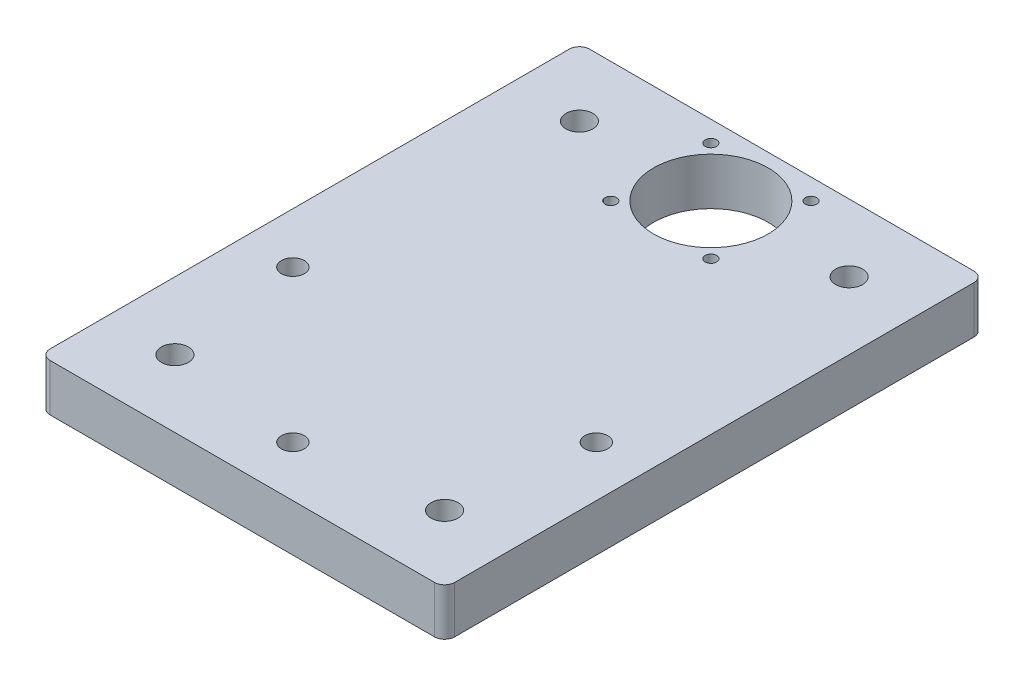
ISO-10303-21;
HEADER;
FILE_DESCRIPTION(('STEP AP214'),'2;1');
FILE_NAME('part.step','',(''),(''),'','','');
FILE_SCHEMA(('AUTOMOTIVE_DESIGN { 1 0 10303 214 1 1 1 1 }'));
ENDSEC;
DATA;
#1=APPLICATION_CONTEXT('core data for automotive mechanical design processes');
#2=APPLICATION_PROTOCOL_DEFINITION('international standard','automotive_design',2000,#1);
#3=PRODUCT_CONTEXT('',#1,'mechanical');
#4=PRODUCT('Part','Part','',(#3));
#5=PRODUCT_RELATED_PRODUCT_CATEGORY('part','',(#4));
#6=PRODUCT_DEFINITION_FORMATION('','',#4);
#7=PRODUCT_DEFINITION_CONTEXT('part definition',#1,'design');
#8=PRODUCT_DEFINITION('design','',#6,#7);
#9=PRODUCT_DEFINITION_SHAPE('','',#8);
#10=(LENGTH_UNIT() NAMED_UNIT(*) SI_UNIT(.MILLI.,.METRE.));
#11=(NAMED_UNIT(*) PLANE_ANGLE_UNIT() SI_UNIT($,.RADIAN.));
#12=(NAMED_UNIT(*) SI_UNIT($,.STERADIAN.) SOLID_ANGLE_UNIT());
#13=UNCERTAINTY_MEASURE_WITH_UNIT(LENGTH_MEASURE(1.E-05),#10,'distance_accuracy_value','');
#14=(GEOMETRIC_REPRESENTATION_CONTEXT(3) GLOBAL_UNCERTAINTY_ASSIGNED_CONTEXT((#13)) GLOBAL_UNIT_ASSIGNED_CONTEXT((#10,
#11,#12)) REPRESENTATION_CONTEXT('',''));
#15=CARTESIAN_POINT('',(0.,0.,0.));
#16=DIRECTION('',(0.,0.,1.));
#17=DIRECTION('',(1.,0.,0.));
#18=AXIS2_PLACEMENT_3D('',#15,#16,#17);
#19=CARTESIAN_POINT('',(-57.,14.,97.));
#20=DIRECTION('',(0.,-1.,0.));
#21=DIRECTION('',(0.,0.,-1.));
#22=AXIS2_PLACEMENT_3D('',#19,#20,#21);
#23=CYLINDRICAL_SURFACE('',#22,3.);
#24=CARTESIAN_POINT('',(-57.,0.,97.));
#25=DIRECTION('',(0.,1.,0.));
#26=DIRECTION('',(0.,0.,-1.));
#27=AXIS2_PLACEMENT_3D('',#24,#25,#26);
#28=CIRCLE('',#27,3.);
#29=CARTESIAN_POINT('',(-60.,0.,97.));
#30=VERTEX_POINT('',#29);
#31=CARTESIAN_POINT('',(-57.,0.,100.));
#32=VERTEX_POINT('',#31);
#33=EDGE_CURVE('E148',#30,#32,#28,.T.);
#34=ORIENTED_EDGE('',*,*,#33,.T.);
#35=DIRECTION('',(0.,-1.,0.));
#36=VECTOR('',#35,1.);
#37=CARTESIAN_POINT('',(-57.,14.,100.));
#38=LINE('',#37,#36);
#39=CARTESIAN_POINT('',(-57.,14.,100.));
#40=VERTEX_POINT('',#39);
#41=EDGE_CURVE('E11',#40,#32,#38,.T.);
#42=ORIENTED_EDGE('',*,*,#41,.F.);
#43=CARTESIAN_POINT('',(-57.,14.,97.));
#44=DIRECTION('',(0.,1.,0.));
#45=DIRECTION('',(0.,0.,-1.));
#46=AXIS2_PLACEMENT_3D('',#43,#44,#45);
#47=CIRCLE('',#46,3.);
#48=CARTESIAN_POINT('',(-60.,14.,97.));
#49=VERTEX_POINT('',#48);
#50=EDGE_CURVE('E173',#49,#40,#47,.T.);
#51=ORIENTED_EDGE('',*,*,#50,.F.);
#52=DIRECTION('',(0.,-1.,0.));
#53=VECTOR('',#52,1.);
#54=CARTESIAN_POINT('',(-60.,14.,97.));
#55=LINE('',#54,#53);
#56=EDGE_CURVE('E147',#49,#30,#55,.T.);
#57=ORIENTED_EDGE('',*,*,#56,.T.);
#58=EDGE_LOOP('',(#34,#42,#51,#57));
#59=FACE_BOUND('',#58,.T.);
#60=ADVANCED_FACE('F50',(#59),#23,.T.);
#61=CARTESIAN_POINT('',(-57.,14.,100.));
#62=DIRECTION('',(0.,0.,-1.));
#63=DIRECTION('',(-1.,0.,0.));
#64=AXIS2_PLACEMENT_3D('',#61,#62,#63);
#65=PLANE('',#64);
#66=DIRECTION('',(1.,0.,0.));
#67=VECTOR('',#66,1.);
#68=CARTESIAN_POINT('',(-57.,0.,100.));
#69=LINE('',#68,#67);
#70=CARTESIAN_POINT('',(57.,0.,100.));
#71=VERTEX_POINT('',#70);
#72=EDGE_CURVE('E155',#32,#71,#69,.T.);
#73=ORIENTED_EDGE('',*,*,#72,.T.);
#74=DIRECTION('',(0.,-1.,0.));
#75=VECTOR('',#74,1.);
#76=CARTESIAN_POINT('',(57.,14.,100.));
#77=LINE('',#76,#75);
#78=CARTESIAN_POINT('',(57.,14.,100.));
#79=VERTEX_POINT('',#78);
#80=EDGE_CURVE('E57',#79,#71,#77,.T.);
#81=ORIENTED_EDGE('',*,*,#80,.F.);
#82=DIRECTION('',(1.,0.,0.));
#83=VECTOR('',#82,1.);
#84=CARTESIAN_POINT('',(-57.,14.,100.));
#85=LINE('',#84,#83);
#86=EDGE_CURVE('E110',#40,#79,#85,.T.);
#87=ORIENTED_EDGE('',*,*,#86,.F.);
#88=ORIENTED_EDGE('',*,*,#41,.T.);
#89=EDGE_LOOP('',(#73,#81,#87,#88));
#90=FACE_BOUND('',#89,.T.);
#91=ADVANCED_FACE('F350',(#90),#65,.F.);
#92=CARTESIAN_POINT('',(57.,14.,97.));
#93=DIRECTION('',(0.,-1.,0.));
#94=DIRECTION('',(0.,0.,-1.));
#95=AXIS2_PLACEMENT_3D('',#92,#93,#94);
#96=CYLINDRICAL_SURFACE('',#95,3.);
#97=CARTESIAN_POINT('',(57.,0.,97.));
#98=DIRECTION('',(0.,1.,0.));
#99=DIRECTION('',(0.,0.,1.));
#100=AXIS2_PLACEMENT_3D('',#97,#98,#99);
#101=CIRCLE('',#100,3.);
#102=CARTESIAN_POINT('',(60.,0.,97.));
#103=VERTEX_POINT('',#102);
#104=EDGE_CURVE('E158',#71,#103,#101,.T.);
#105=ORIENTED_EDGE('',*,*,#104,.T.);
#106=DIRECTION('',(0.,-1.,0.));
#107=VECTOR('',#106,1.);
#108=CARTESIAN_POINT('',(60.,14.,97.));
#109=LINE('',#108,#107);
#110=CARTESIAN_POINT('',(60.,14.,97.));
#111=VERTEX_POINT('',#110);
#112=EDGE_CURVE('E183',#111,#103,#109,.T.);
#113=ORIENTED_EDGE('',*,*,#112,.F.);
#114=CARTESIAN_POINT('',(57.,14.,97.));
#115=DIRECTION('',(0.,1.,0.));
#116=DIRECTION('',(0.,0.,1.));
#117=AXIS2_PLACEMENT_3D('',#114,#115,#116);
#118=CIRCLE('',#117,3.);
#119=EDGE_CURVE('E193',#79,#111,#118,.T.);
#120=ORIENTED_EDGE('',*,*,#119,.F.);
#121=ORIENTED_EDGE('',*,*,#80,.T.);
#122=EDGE_LOOP('',(#105,#113,#120,#121));
#123=FACE_BOUND('',#122,.T.);
#124=ADVANCED_FACE('F194',(#123),#96,.T.);
#125=CARTESIAN_POINT('',(60.,14.,97.));
#126=DIRECTION('',(-1.,0.,0.));
#127=DIRECTION('',(0.,0.,1.));
#128=AXIS2_PLACEMENT_3D('',#125,#126,#127);
#129=PLANE('',#128);
#130=DIRECTION('',(0.,0.,-1.));
#131=VECTOR('',#130,1.);
#132=CARTESIAN_POINT('',(60.,0.,97.));
#133=LINE('',#132,#131);
#134=CARTESIAN_POINT('',(60.,0.,-57.));
#135=VERTEX_POINT('',#134);
#136=EDGE_CURVE('E163',#103,#135,#133,.T.);
#137=ORIENTED_EDGE('',*,*,#136,.T.);
#138=DIRECTION('',(0.,-1.,0.));
#139=VECTOR('',#138,1.);
#140=CARTESIAN_POINT('',(60.,14.,-57.));
#141=LINE('',#140,#139);
#142=CARTESIAN_POINT('',(60.,14.,-57.));
#143=VERTEX_POINT('',#142);
#144=EDGE_CURVE('E179',#143,#135,#141,.T.);
#145=ORIENTED_EDGE('',*,*,#144,.F.);
#146=DIRECTION('',(0.,0.,-1.));
#147=VECTOR('',#146,1.);
#148=CARTESIAN_POINT('',(60.,14.,97.));
#149=LINE('',#148,#147);
#150=EDGE_CURVE('E206',#111,#143,#149,.T.);
#151=ORIENTED_EDGE('',*,*,#150,.F.);
#152=ORIENTED_EDGE('',*,*,#112,.T.);
#153=EDGE_LOOP('',(#137,#145,#151,#152));
#154=FACE_BOUND('',#153,.T.);
#155=ADVANCED_FACE('F203',(#154),#129,.F.);
#156=CARTESIAN_POINT('',(57.,14.,-57.));
#157=DIRECTION('',(0.,-1.,0.));
#158=DIRECTION('',(0.,0.,-1.));
#159=AXIS2_PLACEMENT_3D('',#156,#157,#158);
#160=CYLINDRICAL_SURFACE('',#159,3.);
#161=CARTESIAN_POINT('',(57.,0.,-57.));
#162=DIRECTION('',(0.,1.,0.));
#163=DIRECTION('',(0.,0.,-1.));
#164=AXIS2_PLACEMENT_3D('',#161,#162,#163);
#165=CIRCLE('',#164,3.);
#166=CARTESIAN_POINT('',(57.,0.,-60.));
#167=VERTEX_POINT('',#166);
#168=EDGE_CURVE('E165',#135,#167,#165,.T.);
#169=ORIENTED_EDGE('',*,*,#168,.T.);
#170=DIRECTION('',(0.,-1.,0.));
#171=VECTOR('',#170,1.);
#172=CARTESIAN_POINT('',(57.,14.,-60.));
#173=LINE('',#172,#171);
#174=CARTESIAN_POINT('',(57.,14.,-60.));
#175=VERTEX_POINT('',#174);
#176=EDGE_CURVE('E140',#175,#167,#173,.T.);
#177=ORIENTED_EDGE('',*,*,#176,.F.);
#178=CARTESIAN_POINT('',(57.,14.,-57.));
#179=DIRECTION('',(0.,1.,0.));
#180=DIRECTION('',(0.,0.,-1.));
#181=AXIS2_PLACEMENT_3D('',#178,#179,#180);
#182=CIRCLE('',#181,3.);
#183=EDGE_CURVE('E127',#143,#175,#182,.T.);
#184=ORIENTED_EDGE('',*,*,#183,.F.);
#185=ORIENTED_EDGE('',*,*,#144,.T.);
#186=EDGE_LOOP('',(#169,#177,#184,#185));
#187=FACE_BOUND('',#186,.T.);
#188=ADVANCED_FACE('F207',(#187),#160,.T.);
#189=CARTESIAN_POINT('',(-57.,14.,-60.));
#190=DIRECTION('',(0.,0.,1.));
#191=DIRECTION('',(1.,0.,0.));
#192=AXIS2_PLACEMENT_3D('',#189,#190,#191);
#193=PLANE('',#192);
#194=DIRECTION('',(-1.,0.,0.));
#195=VECTOR('',#194,1.);
#196=CARTESIAN_POINT('',(-57.,0.,-60.));
#197=LINE('',#196,#195);
#198=CARTESIAN_POINT('',(-57.,0.,-60.));
#199=VERTEX_POINT('',#198);
#200=EDGE_CURVE('E131',#167,#199,#197,.T.);
#201=ORIENTED_EDGE('',*,*,#200,.T.);
#202=DIRECTION('',(0.,-1.,0.));
#203=VECTOR('',#202,1.);
#204=CARTESIAN_POINT('',(-57.,14.,-60.));
#205=LINE('',#204,#203);
#206=CARTESIAN_POINT('',(-57.,14.,-60.));
#207=VERTEX_POINT('',#206);
#208=EDGE_CURVE('E134',#207,#199,#205,.T.);
#209=ORIENTED_EDGE('',*,*,#208,.F.);
#210=DIRECTION('',(-1.,0.,0.));
#211=VECTOR('',#210,1.);
#212=CARTESIAN_POINT('',(-57.,14.,-60.));
#213=LINE('',#212,#211);
#214=EDGE_CURVE('E119',#175,#207,#213,.T.);
#215=ORIENTED_EDGE('',*,*,#214,.F.);
#216=ORIENTED_EDGE('',*,*,#176,.T.);
#217=EDGE_LOOP('',(#201,#209,#215,#216));
#218=FACE_BOUND('',#217,.T.);
#219=ADVANCED_FACE('F132',(#218),#193,.F.);
#220=CARTESIAN_POINT('',(-57.,14.,-57.));
#221=DIRECTION('',(0.,-1.,0.));
#222=DIRECTION('',(0.,0.,-1.));
#223=AXIS2_PLACEMENT_3D('',#220,#221,#222);
#224=CYLINDRICAL_SURFACE('',#223,3.);
#225=CARTESIAN_POINT('',(-57.,0.,-57.));
#226=DIRECTION('',(0.,1.,0.));
#227=DIRECTION('',(0.,0.,-1.));
#228=AXIS2_PLACEMENT_3D('',#225,#226,#227);
#229=CIRCLE('',#228,3.);
#230=CARTESIAN_POINT('',(-60.,0.,-57.));
#231=VERTEX_POINT('',#230);
#232=EDGE_CURVE('E93',#199,#231,#229,.T.);
#233=ORIENTED_EDGE('',*,*,#232,.T.);
#234=DIRECTION('',(0.,-1.,0.));
#235=VECTOR('',#234,1.);
#236=CARTESIAN_POINT('',(-60.,14.,-57.));
#237=LINE('',#236,#235);
#238=CARTESIAN_POINT('',(-60.,14.,-57.));
#239=VERTEX_POINT('',#238);
#240=EDGE_CURVE('E138',#239,#231,#237,.T.);
#241=ORIENTED_EDGE('',*,*,#240,.F.);
#242=CARTESIAN_POINT('',(-57.,14.,-57.));
#243=DIRECTION('',(0.,1.,0.));
#244=DIRECTION('',(0.,0.,-1.));
#245=AXIS2_PLACEMENT_3D('',#242,#243,#244);
#246=CIRCLE('',#245,3.);
#247=EDGE_CURVE('E121',#207,#239,#246,.T.);
#248=ORIENTED_EDGE('',*,*,#247,.F.);
#249=ORIENTED_EDGE('',*,*,#208,.T.);
#250=EDGE_LOOP('',(#233,#241,#248,#249));
#251=FACE_BOUND('',#250,.T.);
#252=ADVANCED_FACE('F136',(#251),#224,.T.);
#253=CARTESIAN_POINT('',(-60.,14.,97.));
#254=DIRECTION('',(1.,0.,0.));
#255=DIRECTION('',(0.,0.,-1.));
#256=AXIS2_PLACEMENT_3D('',#253,#254,#255);
#257=PLANE('',#256);
#258=DIRECTION('',(0.,0.,1.));
#259=VECTOR('',#258,1.);
#260=CARTESIAN_POINT('',(-60.,0.,97.));
#261=LINE('',#260,#259);
#262=EDGE_CURVE('E100',#231,#30,#261,.T.);
#263=ORIENTED_EDGE('',*,*,#262,.T.);
#264=ORIENTED_EDGE('',*,*,#56,.F.);
#265=DIRECTION('',(0.,0.,1.));
#266=VECTOR('',#265,1.);
#267=CARTESIAN_POINT('',(-60.,14.,97.));
#268=LINE('',#267,#266);
#269=EDGE_CURVE('E61',#239,#49,#268,.T.);
#270=ORIENTED_EDGE('',*,*,#269,.F.);
#271=ORIENTED_EDGE('',*,*,#240,.T.);
#272=EDGE_LOOP('',(#263,#264,#270,#271));
#273=FACE_BOUND('',#272,.T.);
#274=ADVANCED_FACE('F351',(#273),#257,.F.);
#275=CARTESIAN_POINT('',(-57.,14.,97.));
#276=DIRECTION('',(0.,-1.,0.));
#277=DIRECTION('',(0.,0.,-1.));
#278=AXIS2_PLACEMENT_3D('',#275,#276,#277);
#279=PLANE('',#278);
#280=CARTESIAN_POINT('',(-40.,14.,80.));
#281=DIRECTION('',(0.,-1.,0.));
#282=DIRECTION('',(0.,0.,1.));
#283=AXIS2_PLACEMENT_3D('',#280,#281,#282);
#284=CIRCLE('',#283,4.00000000000001);
#285=CARTESIAN_POINT('',(-40.,14.,84.));
#286=VERTEX_POINT('',#285);
#287=EDGE_CURVE('E298',#286,#286,#284,.T.);
#288=ORIENTED_EDGE('',*,*,#287,.T.);
#289=EDGE_LOOP('',(#288));
#290=FACE_BOUND('',#289,.T.);
#291=CARTESIAN_POINT('',(40.,14.,-39.9999999999999));
#292=DIRECTION('',(0.,-1.,0.));
#293=DIRECTION('',(0.,0.,1.));
#294=AXIS2_PLACEMENT_3D('',#291,#292,#293);
#295=CIRCLE('',#294,4.00000000000001);
#296=CARTESIAN_POINT('',(40.,14.,-35.9999999999999));
#297=VERTEX_POINT('',#296);
#298=EDGE_CURVE('E290',#297,#297,#295,.T.);
#299=ORIENTED_EDGE('',*,*,#298,.T.);
#300=EDGE_LOOP('',(#299));
#301=FACE_BOUND('',#300,.T.);
#302=CARTESIAN_POINT('',(-39.9999999999999,14.,-40.));
#303=DIRECTION('',(0.,-1.,0.));
#304=DIRECTION('',(0.,0.,-1.));
#305=AXIS2_PLACEMENT_3D('',#302,#303,#304);
#306=CIRCLE('',#305,4.00000000000001);
#307=CARTESIAN_POINT('',(-39.9999999999999,14.,-44.));
#308=VERTEX_POINT('',#307);
#309=EDGE_CURVE('E303',#308,#308,#306,.T.);
#310=ORIENTED_EDGE('',*,*,#309,.T.);
#311=EDGE_LOOP('',(#310));
#312=FACE_BOUND('',#311,.T.);
#313=CARTESIAN_POINT('',(40.,14.,80.));
#314=DIRECTION('',(0.,-1.,0.));
#315=DIRECTION('',(0.,0.,-1.));
#316=AXIS2_PLACEMENT_3D('',#313,#314,#315);
#317=CIRCLE('',#316,4.00000000000001);
#318=CARTESIAN_POINT('',(40.,14.,76.));
#319=VERTEX_POINT('',#318);
#320=EDGE_CURVE('E277',#319,#319,#317,.T.);
#321=ORIENTED_EDGE('',*,*,#320,.T.);
#322=EDGE_LOOP('',(#321));
#323=FACE_BOUND('',#322,.T.);
#324=CARTESIAN_POINT('',(4.0628570386475E-09,14.,-38.9999999963511));
#325=DIRECTION('',(0.,1.,0.));
#326=DIRECTION('',(0.,0.,1.));
#327=AXIS2_PLACEMENT_3D('',#324,#325,#326);
#328=CIRCLE('',#327,16.999999997182);
#329=CARTESIAN_POINT('',(4.0628570386475E-09,14.,-21.9999999991691));
#330=VERTEX_POINT('',#329);
#331=EDGE_CURVE('E275',#330,#330,#328,.T.);
#332=ORIENTED_EDGE('',*,*,#331,.F.);
#333=EDGE_LOOP('',(#332));
#334=FACE_BOUND('',#333,.T.);
#335=CARTESIAN_POINT('',(2.35055030994857E-13,14.,85.));
#336=DIRECTION('',(0.,-1.,0.));
#337=DIRECTION('',(0.,0.,-1.));
#338=AXIS2_PLACEMENT_3D('',#335,#336,#337);
#339=CIRCLE('',#338,3.4);
#340=CARTESIAN_POINT('',(2.35055030994857E-13,14.,81.6));
#341=VERTEX_POINT('',#340);
#342=EDGE_CURVE('E229',#341,#341,#339,.T.);
#343=ORIENTED_EDGE('',*,*,#342,.T.);
#344=EDGE_LOOP('',(#343));
#345=FACE_BOUND('',#344,.T.);
#346=CARTESIAN_POINT('',(45.,14.,40.));
#347=DIRECTION('',(0.,-1.,0.));
#348=DIRECTION('',(0.,0.,-1.));
#349=AXIS2_PLACEMENT_3D('',#346,#347,#348);
#350=CIRCLE('',#349,3.4);
#351=CARTESIAN_POINT('',(45.,14.,36.6));
#352=VERTEX_POINT('',#351);
#353=EDGE_CURVE('E260',#352,#352,#350,.T.);
#354=ORIENTED_EDGE('',*,*,#353,.T.);
#355=EDGE_LOOP('',(#354));
#356=FACE_BOUND('',#355,.T.);
#357=CARTESIAN_POINT('',(-45.,14.,40.));
#358=DIRECTION('',(0.,-1.,0.));
#359=DIRECTION('',(0.,0.,-1.));
#360=AXIS2_PLACEMENT_3D('',#357,#358,#359);
#361=CIRCLE('',#360,3.4);
#362=CARTESIAN_POINT('',(-45.,14.,36.6));
#363=VERTEX_POINT('',#362);
#364=EDGE_CURVE('E247',#363,#363,#361,.T.);
#365=ORIENTED_EDGE('',*,*,#364,.T.);
#366=EDGE_LOOP('',(#365));
#367=FACE_BOUND('',#366,.T.);
#368=CARTESIAN_POINT('',(-14.8492424049172,14.,-24.1507575950818));
#369=DIRECTION('',(0.,-1.,0.));
#370=DIRECTION('',(0.,0.,-1.));
#371=AXIS2_PLACEMENT_3D('',#368,#369,#370);
#372=CIRCLE('',#371,1.7);
#373=CARTESIAN_POINT('',(-14.8492424049172,14.,-25.8507575950818));
#374=VERTEX_POINT('',#373);
#375=EDGE_CURVE('E228',#374,#374,#372,.T.);
#376=ORIENTED_EDGE('',*,*,#375,.T.);
#377=EDGE_LOOP('',(#376));
#378=FACE_BOUND('',#377,.T.);
#379=CARTESIAN_POINT('',(-14.8492424049171,14.,-53.8492424049168));
#380=DIRECTION('',(0.,-1.,0.));
#381=DIRECTION('',(0.,0.,-1.));
#382=AXIS2_PLACEMENT_3D('',#379,#380,#381);
#383=CIRCLE('',#382,1.7);
#384=CARTESIAN_POINT('',(-14.8492424049171,14.,-55.5492424049168));
#385=VERTEX_POINT('',#384);
#386=EDGE_CURVE('E234',#385,#385,#383,.T.);
#387=ORIENTED_EDGE('',*,*,#386,.T.);
#388=EDGE_LOOP('',(#387));
#389=FACE_BOUND('',#388,.T.);
#390=CARTESIAN_POINT('',(14.849242404918,14.,-53.8492424049166));
#391=DIRECTION('',(0.,-1.,0.));
#392=DIRECTION('',(0.,0.,-1.));
#393=AXIS2_PLACEMENT_3D('',#390,#391,#392);
#394=CIRCLE('',#393,1.7);
#395=CARTESIAN_POINT('',(14.849242404918,14.,-55.5492424049166));
#396=VERTEX_POINT('',#395);
#397=EDGE_CURVE('E241',#396,#396,#394,.T.);
#398=ORIENTED_EDGE('',*,*,#397,.T.);
#399=EDGE_LOOP('',(#398));
#400=FACE_BOUND('',#399,.T.);
#401=CARTESIAN_POINT('',(14.8492424049178,14.,-24.1507575950817));
#402=DIRECTION('',(0.,-1.,0.));
#403=DIRECTION('',(0.,0.,-1.));
#404=AXIS2_PLACEMENT_3D('',#401,#402,#403);
#405=CIRCLE('',#404,1.7);
#406=CARTESIAN_POINT('',(14.8492424049178,14.,-25.8507575950817));
#407=VERTEX_POINT('',#406);
#408=EDGE_CURVE('E151',#407,#407,#405,.T.);
#409=ORIENTED_EDGE('',*,*,#408,.T.);
#410=EDGE_LOOP('',(#409));
#411=FACE_BOUND('',#410,.T.);
#412=ORIENTED_EDGE('',*,*,#50,.T.);
#413=ORIENTED_EDGE('',*,*,#86,.T.);
#414=ORIENTED_EDGE('',*,*,#119,.T.);
#415=ORIENTED_EDGE('',*,*,#150,.T.);
#416=ORIENTED_EDGE('',*,*,#183,.T.);
#417=ORIENTED_EDGE('',*,*,#214,.T.);
#418=ORIENTED_EDGE('',*,*,#247,.T.);
#419=ORIENTED_EDGE('',*,*,#269,.T.);
#420=EDGE_LOOP('',(#412,#413,#414,#415,#416,#417,#418,#419));
#421=FACE_BOUND('',#420,.T.);
#422=ADVANCED_FACE('F125',(#290,#301,#312,#323,#334,#345,#356,#367,#378,#389,#400,#411,#421),
#279,.F.);
#423=CARTESIAN_POINT('',(-57.,0.,97.));
#424=DIRECTION('',(0.,-1.,0.));
#425=DIRECTION('',(0.,0.,-1.));
#426=AXIS2_PLACEMENT_3D('',#423,#424,#425);
#427=PLANE('',#426);
#428=CARTESIAN_POINT('',(-40.,0.,80.));
#429=DIRECTION('',(0.,-1.,0.));
#430=DIRECTION('',(0.,0.,1.));
#431=AXIS2_PLACEMENT_3D('',#428,#429,#430);
#432=CIRCLE('',#431,4.00000000000001);
#433=CARTESIAN_POINT('',(-40.,0.,84.));
#434=VERTEX_POINT('',#433);
#435=EDGE_CURVE('E285',#434,#434,#432,.T.);
#436=ORIENTED_EDGE('',*,*,#435,.F.);
#437=EDGE_LOOP('',(#436));
#438=FACE_BOUND('',#437,.T.);
#439=CARTESIAN_POINT('',(40.,0.,-39.9999999999999));
#440=DIRECTION('',(0.,-1.,0.));
#441=DIRECTION('',(0.,0.,1.));
#442=AXIS2_PLACEMENT_3D('',#439,#440,#441);
#443=CIRCLE('',#442,4.00000000000001);
#444=CARTESIAN_POINT('',(40.,0.,-35.9999999999999));
#445=VERTEX_POINT('',#444);
#446=EDGE_CURVE('E293',#445,#445,#443,.T.);
#447=ORIENTED_EDGE('',*,*,#446,.F.);
#448=EDGE_LOOP('',(#447));
#449=FACE_BOUND('',#448,.T.);
#450=CARTESIAN_POINT('',(-39.9999999999999,0.,-40.));
#451=DIRECTION('',(0.,-1.,0.));
#452=DIRECTION('',(0.,0.,-1.));
#453=AXIS2_PLACEMENT_3D('',#450,#451,#452);
#454=CIRCLE('',#453,4.00000000000001);
#455=CARTESIAN_POINT('',(-39.9999999999999,0.,-44.));
#456=VERTEX_POINT('',#455);
#457=EDGE_CURVE('E292',#456,#456,#454,.T.);
#458=ORIENTED_EDGE('',*,*,#457,.F.);
#459=EDGE_LOOP('',(#458));
#460=FACE_BOUND('',#459,.T.);
#461=CARTESIAN_POINT('',(40.,0.,80.));
#462=DIRECTION('',(0.,-1.,0.));
#463=DIRECTION('',(0.,0.,-1.));
#464=AXIS2_PLACEMENT_3D('',#461,#462,#463);
#465=CIRCLE('',#464,4.00000000000001);
#466=CARTESIAN_POINT('',(40.,0.,76.));
#467=VERTEX_POINT('',#466);
#468=EDGE_CURVE('E278',#467,#467,#465,.T.);
#469=ORIENTED_EDGE('',*,*,#468,.F.);
#470=EDGE_LOOP('',(#469));
#471=FACE_BOUND('',#470,.T.);
#472=CARTESIAN_POINT('',(4.0628570386475E-09,0.,-38.9999999963511));
#473=DIRECTION('',(0.,1.,0.));
#474=DIRECTION('',(0.,0.,1.));
#475=AXIS2_PLACEMENT_3D('',#472,#473,#474);
#476=CIRCLE('',#475,16.999999997182);
#477=CARTESIAN_POINT('',(4.0628570386475E-09,0.,-21.9999999991691));
#478=VERTEX_POINT('',#477);
#479=EDGE_CURVE('E254',#478,#478,#476,.T.);
#480=ORIENTED_EDGE('',*,*,#479,.T.);
#481=EDGE_LOOP('',(#480));
#482=FACE_BOUND('',#481,.T.);
#483=CARTESIAN_POINT('',(2.35055030994857E-13,0.,85.));
#484=DIRECTION('',(0.,-1.,0.));
#485=DIRECTION('',(0.,0.,-1.));
#486=AXIS2_PLACEMENT_3D('',#483,#484,#485);
#487=CIRCLE('',#486,3.4);
#488=CARTESIAN_POINT('',(2.35055030994857E-13,0.,81.6));
#489=VERTEX_POINT('',#488);
#490=EDGE_CURVE('E261',#489,#489,#487,.T.);
#491=ORIENTED_EDGE('',*,*,#490,.F.);
#492=EDGE_LOOP('',(#491));
#493=FACE_BOUND('',#492,.T.);
#494=CARTESIAN_POINT('',(45.,0.,40.));
#495=DIRECTION('',(0.,-1.,0.));
#496=DIRECTION('',(0.,0.,-1.));
#497=AXIS2_PLACEMENT_3D('',#494,#495,#496);
#498=CIRCLE('',#497,3.4);
#499=CARTESIAN_POINT('',(45.,0.,36.6));
#500=VERTEX_POINT('',#499);
#501=EDGE_CURVE('E263',#500,#500,#498,.T.);
#502=ORIENTED_EDGE('',*,*,#501,.F.);
#503=EDGE_LOOP('',(#502));
#504=FACE_BOUND('',#503,.T.);
#505=CARTESIAN_POINT('',(-45.,0.,40.));
#506=DIRECTION('',(0.,-1.,0.));
#507=DIRECTION('',(0.,0.,-1.));
#508=AXIS2_PLACEMENT_3D('',#505,#506,#507);
#509=CIRCLE('',#508,3.4);
#510=CARTESIAN_POINT('',(-45.,0.,36.6));
#511=VERTEX_POINT('',#510);
#512=EDGE_CURVE('E255',#511,#511,#509,.T.);
#513=ORIENTED_EDGE('',*,*,#512,.F.);
#514=EDGE_LOOP('',(#513));
#515=FACE_BOUND('',#514,.T.);
#516=CARTESIAN_POINT('',(-14.8492424049172,0.,-24.1507575950818));
#517=DIRECTION('',(0.,-1.,0.));
#518=DIRECTION('',(0.,0.,-1.));
#519=AXIS2_PLACEMENT_3D('',#516,#517,#518);
#520=CIRCLE('',#519,1.7);
#521=CARTESIAN_POINT('',(-14.8492424049172,0.,-25.8507575950818));
#522=VERTEX_POINT('',#521);
#523=EDGE_CURVE('E230',#522,#522,#520,.T.);
#524=ORIENTED_EDGE('',*,*,#523,.F.);
#525=EDGE_LOOP('',(#524));
#526=FACE_BOUND('',#525,.T.);
#527=CARTESIAN_POINT('',(-14.8492424049171,0.,-53.8492424049168));
#528=DIRECTION('',(0.,-1.,0.));
#529=DIRECTION('',(0.,0.,-1.));
#530=AXIS2_PLACEMENT_3D('',#527,#528,#529);
#531=CIRCLE('',#530,1.7);
#532=CARTESIAN_POINT('',(-14.8492424049171,0.,-55.5492424049168));
#533=VERTEX_POINT('',#532);
#534=EDGE_CURVE('E238',#533,#533,#531,.T.);
#535=ORIENTED_EDGE('',*,*,#534,.F.);
#536=EDGE_LOOP('',(#535));
#537=FACE_BOUND('',#536,.T.);
#538=CARTESIAN_POINT('',(14.849242404918,0.,-53.8492424049166));
#539=DIRECTION('',(0.,-1.,0.));
#540=DIRECTION('',(0.,0.,-1.));
#541=AXIS2_PLACEMENT_3D('',#538,#539,#540);
#542=CIRCLE('',#541,1.7);
#543=CARTESIAN_POINT('',(14.849242404918,0.,-55.5492424049166));
#544=VERTEX_POINT('',#543);
#545=EDGE_CURVE('E225',#544,#544,#542,.T.);
#546=ORIENTED_EDGE('',*,*,#545,.F.);
#547=EDGE_LOOP('',(#546));
#548=FACE_BOUND('',#547,.T.);
#549=CARTESIAN_POINT('',(14.8492424049178,0.,-24.1507575950817));
#550=DIRECTION('',(0.,-1.,0.));
#551=DIRECTION('',(0.,0.,-1.));
#552=AXIS2_PLACEMENT_3D('',#549,#550,#551);
#553=CIRCLE('',#552,1.7);
#554=CARTESIAN_POINT('',(14.8492424049178,0.,-25.8507575950817));
#555=VERTEX_POINT('',#554);
#556=EDGE_CURVE('E217',#555,#555,#553,.T.);
#557=ORIENTED_EDGE('',*,*,#556,.F.);
#558=EDGE_LOOP('',(#557));
#559=FACE_BOUND('',#558,.T.);
#560=ORIENTED_EDGE('',*,*,#33,.F.);
#561=ORIENTED_EDGE('',*,*,#262,.F.);
#562=ORIENTED_EDGE('',*,*,#232,.F.);
#563=ORIENTED_EDGE('',*,*,#200,.F.);
#564=ORIENTED_EDGE('',*,*,#168,.F.);
#565=ORIENTED_EDGE('',*,*,#136,.F.);
#566=ORIENTED_EDGE('',*,*,#104,.F.);
#567=ORIENTED_EDGE('',*,*,#72,.F.);
#568=EDGE_LOOP('',(#560,#561,#562,#563,#564,#565,#566,#567));
#569=FACE_BOUND('',#568,.T.);
#570=ADVANCED_FACE('F200',(#438,#449,#460,#471,#482,#493,#504,#515,#526,#537,#548,#559,#569),
#427,.T.);
#571=CARTESIAN_POINT('',(14.8492424049178,14.,-24.1507575950817));
#572=DIRECTION('',(0.,-1.,0.));
#573=DIRECTION('',(0.,0.,-1.));
#574=AXIS2_PLACEMENT_3D('',#571,#572,#573);
#575=CYLINDRICAL_SURFACE('',#574,1.7);
#576=ORIENTED_EDGE('',*,*,#408,.F.);
#577=EDGE_LOOP('',(#576));
#578=FACE_BOUND('',#577,.T.);
#579=ORIENTED_EDGE('',*,*,#556,.T.);
#580=EDGE_LOOP('',(#579));
#581=FACE_BOUND('',#580,.T.);
#582=ADVANCED_FACE('F314',(#578,#581),#575,.F.);
#583=CARTESIAN_POINT('',(14.849242404918,14.,-53.8492424049166));
#584=DIRECTION('',(0.,-1.,0.));
#585=DIRECTION('',(0.,0.,-1.));
#586=AXIS2_PLACEMENT_3D('',#583,#584,#585);
#587=CYLINDRICAL_SURFACE('',#586,1.7);
#588=ORIENTED_EDGE('',*,*,#397,.F.);
#589=EDGE_LOOP('',(#588));
#590=FACE_BOUND('',#589,.T.);
#591=ORIENTED_EDGE('',*,*,#545,.T.);
#592=EDGE_LOOP('',(#591));
#593=FACE_BOUND('',#592,.T.);
#594=ADVANCED_FACE('F340',(#590,#593),#587,.F.);
#595=CARTESIAN_POINT('',(-14.8492424049171,14.,-53.8492424049168));
#596=DIRECTION('',(0.,-1.,0.));
#597=DIRECTION('',(0.,0.,-1.));
#598=AXIS2_PLACEMENT_3D('',#595,#596,#597);
#599=CYLINDRICAL_SURFACE('',#598,1.7);
#600=ORIENTED_EDGE('',*,*,#386,.F.);
#601=EDGE_LOOP('',(#600));
#602=FACE_BOUND('',#601,.T.);
#603=ORIENTED_EDGE('',*,*,#534,.T.);
#604=EDGE_LOOP('',(#603));
#605=FACE_BOUND('',#604,.T.);
#606=ADVANCED_FACE('F345',(#602,#605),#599,.F.);
#607=CARTESIAN_POINT('',(-14.8492424049172,14.,-24.1507575950818));
#608=DIRECTION('',(0.,-1.,0.));
#609=DIRECTION('',(0.,0.,-1.));
#610=AXIS2_PLACEMENT_3D('',#607,#608,#609);
#611=CYLINDRICAL_SURFACE('',#610,1.7);
#612=ORIENTED_EDGE('',*,*,#375,.F.);
#613=EDGE_LOOP('',(#612));
#614=FACE_BOUND('',#613,.T.);
#615=ORIENTED_EDGE('',*,*,#523,.T.);
#616=EDGE_LOOP('',(#615));
#617=FACE_BOUND('',#616,.T.);
#618=ADVANCED_FACE('F419',(#614,#617),#611,.F.);
#619=CARTESIAN_POINT('',(-45.,14.,40.));
#620=DIRECTION('',(0.,-1.,0.));
#621=DIRECTION('',(0.,0.,-1.));
#622=AXIS2_PLACEMENT_3D('',#619,#620,#621);
#623=CYLINDRICAL_SURFACE('',#622,3.4);
#624=ORIENTED_EDGE('',*,*,#364,.F.);
#625=EDGE_LOOP('',(#624));
#626=FACE_BOUND('',#625,.T.);
#627=ORIENTED_EDGE('',*,*,#512,.T.);
#628=EDGE_LOOP('',(#627));
#629=FACE_BOUND('',#628,.T.);
#630=ADVANCED_FACE('F431',(#626,#629),#623,.F.);
#631=CARTESIAN_POINT('',(45.,14.,40.));
#632=DIRECTION('',(0.,-1.,0.));
#633=DIRECTION('',(0.,0.,-1.));
#634=AXIS2_PLACEMENT_3D('',#631,#632,#633);
#635=CYLINDRICAL_SURFACE('',#634,3.4);
#636=ORIENTED_EDGE('',*,*,#353,.F.);
#637=EDGE_LOOP('',(#636));
#638=FACE_BOUND('',#637,.T.);
#639=ORIENTED_EDGE('',*,*,#501,.T.);
#640=EDGE_LOOP('',(#639));
#641=FACE_BOUND('',#640,.T.);
#642=ADVANCED_FACE('F442',(#638,#641),#635,.F.);
#643=CARTESIAN_POINT('',(2.35055030994857E-13,14.,85.));
#644=DIRECTION('',(0.,-1.,0.));
#645=DIRECTION('',(0.,0.,-1.));
#646=AXIS2_PLACEMENT_3D('',#643,#644,#645);
#647=CYLINDRICAL_SURFACE('',#646,3.4);
#648=ORIENTED_EDGE('',*,*,#342,.F.);
#649=EDGE_LOOP('',(#648));
#650=FACE_BOUND('',#649,.T.);
#651=ORIENTED_EDGE('',*,*,#490,.T.);
#652=EDGE_LOOP('',(#651));
#653=FACE_BOUND('',#652,.T.);
#654=ADVANCED_FACE('F453',(#650,#653),#647,.F.);
#655=CARTESIAN_POINT('',(4.0628570386475E-09,0.,-38.9999999963511));
#656=DIRECTION('',(0.,1.,0.));
#657=DIRECTION('',(0.,0.,1.));
#658=AXIS2_PLACEMENT_3D('',#655,#656,#657);
#659=CYLINDRICAL_SURFACE('',#658,16.999999997182);
#660=ORIENTED_EDGE('',*,*,#479,.F.);
#661=EDGE_LOOP('',(#660));
#662=FACE_BOUND('',#661,.T.);
#663=ORIENTED_EDGE('',*,*,#331,.T.);
#664=EDGE_LOOP('',(#663));
#665=FACE_BOUND('',#664,.T.);
#666=ADVANCED_FACE('F467',(#662,#665),#659,.F.);
#667=CARTESIAN_POINT('',(40.,14.,80.));
#668=DIRECTION('',(0.,-1.,0.));
#669=DIRECTION('',(0.,0.,-1.));
#670=AXIS2_PLACEMENT_3D('',#667,#668,#669);
#671=CYLINDRICAL_SURFACE('',#670,4.00000000000001);
#672=ORIENTED_EDGE('',*,*,#320,.F.);
#673=EDGE_LOOP('',(#672));
#674=FACE_BOUND('',#673,.T.);
#675=ORIENTED_EDGE('',*,*,#468,.T.);
#676=EDGE_LOOP('',(#675));
#677=FACE_BOUND('',#676,.T.);
#678=ADVANCED_FACE('F479',(#674,#677),#671,.F.);
#679=CARTESIAN_POINT('',(-39.9999999999999,14.,-40.));
#680=DIRECTION('',(0.,-1.,0.));
#681=DIRECTION('',(0.,0.,-1.));
#682=AXIS2_PLACEMENT_3D('',#679,#680,#681);
#683=CYLINDRICAL_SURFACE('',#682,4.00000000000001);
#684=ORIENTED_EDGE('',*,*,#309,.F.);
#685=EDGE_LOOP('',(#684));
#686=FACE_BOUND('',#685,.T.);
#687=ORIENTED_EDGE('',*,*,#457,.T.);
#688=EDGE_LOOP('',(#687));
#689=FACE_BOUND('',#688,.T.);
#690=ADVANCED_FACE('F311',(#686,#689),#683,.F.);
#691=CARTESIAN_POINT('',(40.,14.,-39.9999999999999));
#692=DIRECTION('',(0.,-1.,0.));
#693=DIRECTION('',(0.,0.,-1.));
#694=AXIS2_PLACEMENT_3D('',#691,#692,#693);
#695=CYLINDRICAL_SURFACE('',#694,4.00000000000001);
#696=ORIENTED_EDGE('',*,*,#298,.F.);
#697=EDGE_LOOP('',(#696));
#698=FACE_BOUND('',#697,.T.);
#699=ORIENTED_EDGE('',*,*,#446,.T.);
#700=EDGE_LOOP('',(#699));
#701=FACE_BOUND('',#700,.T.);
#702=ADVANCED_FACE('F506',(#698,#701),#695,.F.);
#703=CARTESIAN_POINT('',(-40.,14.,80.));
#704=DIRECTION('',(0.,-1.,0.));
#705=DIRECTION('',(0.,0.,-1.));
#706=AXIS2_PLACEMENT_3D('',#703,#704,#705);
#707=CYLINDRICAL_SURFACE('',#706,4.00000000000001);
#708=ORIENTED_EDGE('',*,*,#287,.F.);
#709=EDGE_LOOP('',(#708));
#710=FACE_BOUND('',#709,.T.);
#711=ORIENTED_EDGE('',*,*,#435,.T.);
#712=EDGE_LOOP('',(#711));
#713=FACE_BOUND('',#712,.T.);
#714=ADVANCED_FACE('F517',(#710,#713),#707,.F.);
#715=CLOSED_SHELL('',(#60,#91,#124,#155,#188,#219,#252,#274,#422,#570,#582,#594,#606,#618,#630,
#642,#654,#666,#678,#690,#702,#714));
#716=MANIFOLD_SOLID_BREP('B2',#715);
#717=ADVANCED_BREP_SHAPE_REPRESENTATION('',(#18,#716),#14);
#718=SHAPE_DEFINITION_REPRESENTATION(#9,#717);
ENDSEC;
END-ISO-10303-21;
